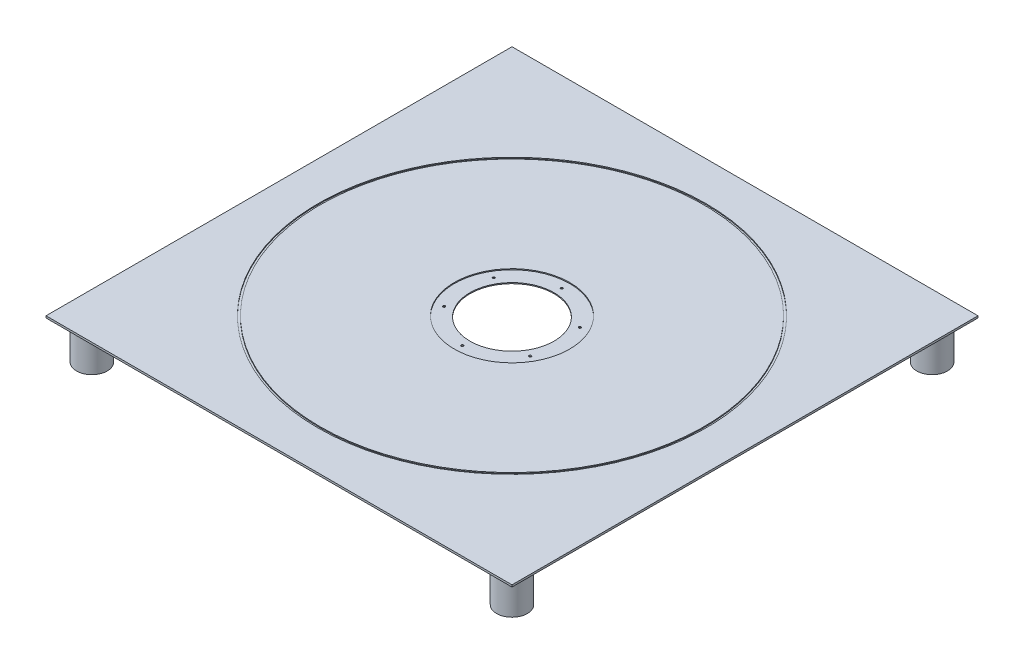
ISO-10303-21;
HEADER;
FILE_DESCRIPTION(('STEP AP214'),'2;1');
FILE_NAME('part.step','',(''),(''),'','','');
FILE_SCHEMA(('AUTOMOTIVE_DESIGN { 1 0 10303 214 1 1 1 1 }'));
ENDSEC;
DATA;
#1=APPLICATION_CONTEXT('core data for automotive mechanical design processes');
#2=APPLICATION_PROTOCOL_DEFINITION('international standard','automotive_design',2000,#1);
#3=PRODUCT_CONTEXT('',#1,'mechanical');
#4=PRODUCT('Part','Part','',(#3));
#5=PRODUCT_RELATED_PRODUCT_CATEGORY('part','',(#4));
#6=PRODUCT_DEFINITION_FORMATION('','',#4);
#7=PRODUCT_DEFINITION_CONTEXT('part definition',#1,'design');
#8=PRODUCT_DEFINITION('design','',#6,#7);
#9=PRODUCT_DEFINITION_SHAPE('','',#8);
#10=(LENGTH_UNIT() NAMED_UNIT(*) SI_UNIT(.MILLI.,.METRE.));
#11=(NAMED_UNIT(*) PLANE_ANGLE_UNIT() SI_UNIT($,.RADIAN.));
#12=(NAMED_UNIT(*) SI_UNIT($,.STERADIAN.) SOLID_ANGLE_UNIT());
#13=UNCERTAINTY_MEASURE_WITH_UNIT(LENGTH_MEASURE(1.E-05),#10,'distance_accuracy_value','');
#14=(GEOMETRIC_REPRESENTATION_CONTEXT(3) GLOBAL_UNCERTAINTY_ASSIGNED_CONTEXT((#13)) GLOBAL_UNIT_ASSIGNED_CONTEXT((#10,
#11,#12)) REPRESENTATION_CONTEXT('',''));
#15=CARTESIAN_POINT('',(0.,0.,0.));
#16=DIRECTION('',(0.,0.,1.));
#17=DIRECTION('',(1.,0.,0.));
#18=AXIS2_PLACEMENT_3D('',#15,#16,#17);
#19=CARTESIAN_POINT('',(0.,2.54,0.));
#20=DIRECTION('',(0.,-1.,0.));
#21=DIRECTION('',(0.,0.,-1.));
#22=AXIS2_PLACEMENT_3D('',#19,#20,#21);
#23=PLANE('',#22);
#24=CARTESIAN_POINT('',(0.,2.54,0.));
#25=DIRECTION('',(0.,-1.,0.));
#26=DIRECTION('',(0.,0.,-1.));
#27=AXIS2_PLACEMENT_3D('',#24,#25,#26);
#28=CIRCLE('',#27,75.5);
#29=CARTESIAN_POINT('',(0.,2.54,-75.5));
#30=VERTEX_POINT('',#29);
#31=EDGE_CURVE('E130',#30,#30,#28,.F.);
#32=ORIENTED_EDGE('',*,*,#31,.F.);
#33=EDGE_LOOP('',(#32));
#34=FACE_BOUND('',#33,.T.);
#35=CARTESIAN_POINT('',(0.,2.54,0.));
#36=DIRECTION('',(0.,1.,0.));
#37=DIRECTION('',(0.,0.,1.));
#38=AXIS2_PLACEMENT_3D('',#35,#36,#37);
#39=CIRCLE('',#38,251.206);
#40=CARTESIAN_POINT('',(0.,2.54,251.206));
#41=VERTEX_POINT('',#40);
#42=EDGE_CURVE('E299',#41,#41,#39,.T.);
#43=ORIENTED_EDGE('',*,*,#42,.T.);
#44=EDGE_LOOP('',(#43));
#45=FACE_BOUND('',#44,.T.);
#46=ADVANCED_FACE('F53',(#34,#45),#23,.F.);
#47=CARTESIAN_POINT('',(304.8,2.54,304.8));
#48=DIRECTION('',(-1.,0.,0.));
#49=DIRECTION('',(0.,0.,1.));
#50=AXIS2_PLACEMENT_3D('',#47,#48,#49);
#51=PLANE('',#50);
#52=DIRECTION('',(0.,0.,-1.));
#53=VECTOR('',#52,1.);
#54=CARTESIAN_POINT('',(304.8,0.,304.8));
#55=LINE('',#54,#53);
#56=CARTESIAN_POINT('',(304.8,0.,304.8));
#57=VERTEX_POINT('',#56);
#58=CARTESIAN_POINT('',(304.8,0.,-304.8));
#59=VERTEX_POINT('',#58);
#60=EDGE_CURVE('E126',#57,#59,#55,.T.);
#61=ORIENTED_EDGE('',*,*,#60,.T.);
#62=DIRECTION('',(0.,-1.,0.));
#63=VECTOR('',#62,1.);
#64=CARTESIAN_POINT('',(304.8,2.54,-304.8));
#65=LINE('',#64,#63);
#66=CARTESIAN_POINT('',(304.8,2.54,-304.8));
#67=VERTEX_POINT('',#66);
#68=EDGE_CURVE('E115',#67,#59,#65,.T.);
#69=ORIENTED_EDGE('',*,*,#68,.F.);
#70=DIRECTION('',(0.,0.,-1.));
#71=VECTOR('',#70,1.);
#72=CARTESIAN_POINT('',(304.8,2.54,304.8));
#73=LINE('',#72,#71);
#74=CARTESIAN_POINT('',(304.8,2.54,304.8));
#75=VERTEX_POINT('',#74);
#76=EDGE_CURVE('E107',#75,#67,#73,.T.);
#77=ORIENTED_EDGE('',*,*,#76,.F.);
#78=DIRECTION('',(0.,-1.,0.));
#79=VECTOR('',#78,1.);
#80=CARTESIAN_POINT('',(304.8,2.54,304.8));
#81=LINE('',#80,#79);
#82=EDGE_CURVE('E122',#75,#57,#81,.T.);
#83=ORIENTED_EDGE('',*,*,#82,.T.);
#84=EDGE_LOOP('',(#61,#69,#77,#83));
#85=FACE_BOUND('',#84,.T.);
#86=ADVANCED_FACE('F55',(#85),#51,.F.);
#87=CARTESIAN_POINT('',(-304.8,2.54,-304.8));
#88=DIRECTION('',(0.,0.,1.));
#89=DIRECTION('',(1.,0.,0.));
#90=AXIS2_PLACEMENT_3D('',#87,#88,#89);
#91=PLANE('',#90);
#92=DIRECTION('',(-1.,0.,0.));
#93=VECTOR('',#92,1.);
#94=CARTESIAN_POINT('',(-304.8,0.,-304.8));
#95=LINE('',#94,#93);
#96=CARTESIAN_POINT('',(-304.8,0.,-304.8));
#97=VERTEX_POINT('',#96);
#98=EDGE_CURVE('E113',#59,#97,#95,.T.);
#99=ORIENTED_EDGE('',*,*,#98,.T.);
#100=DIRECTION('',(0.,-1.,0.));
#101=VECTOR('',#100,1.);
#102=CARTESIAN_POINT('',(-304.8,2.54,-304.8));
#103=LINE('',#102,#101);
#104=CARTESIAN_POINT('',(-304.8,2.54,-304.8));
#105=VERTEX_POINT('',#104);
#106=EDGE_CURVE('E111',#105,#97,#103,.T.);
#107=ORIENTED_EDGE('',*,*,#106,.F.);
#108=DIRECTION('',(-1.,0.,0.));
#109=VECTOR('',#108,1.);
#110=CARTESIAN_POINT('',(-304.8,2.54,-304.8));
#111=LINE('',#110,#109);
#112=EDGE_CURVE('E102',#67,#105,#111,.T.);
#113=ORIENTED_EDGE('',*,*,#112,.F.);
#114=ORIENTED_EDGE('',*,*,#68,.T.);
#115=EDGE_LOOP('',(#99,#107,#113,#114));
#116=FACE_BOUND('',#115,.T.);
#117=ADVANCED_FACE('F112',(#116),#91,.F.);
#118=CARTESIAN_POINT('',(-304.8,2.54,304.8));
#119=DIRECTION('',(1.,0.,0.));
#120=DIRECTION('',(0.,0.,-1.));
#121=AXIS2_PLACEMENT_3D('',#118,#119,#120);
#122=PLANE('',#121);
#123=DIRECTION('',(0.,0.,1.));
#124=VECTOR('',#123,1.);
#125=CARTESIAN_POINT('',(-304.8,0.,304.8));
#126=LINE('',#125,#124);
#127=CARTESIAN_POINT('',(-304.8,0.,304.8));
#128=VERTEX_POINT('',#127);
#129=EDGE_CURVE('E88',#97,#128,#126,.T.);
#130=ORIENTED_EDGE('',*,*,#129,.T.);
#131=DIRECTION('',(0.,-1.,0.));
#132=VECTOR('',#131,1.);
#133=CARTESIAN_POINT('',(-304.8,2.54,304.8));
#134=LINE('',#133,#132);
#135=CARTESIAN_POINT('',(-304.8,2.54,304.8));
#136=VERTEX_POINT('',#135);
#137=EDGE_CURVE('E116',#136,#128,#134,.T.);
#138=ORIENTED_EDGE('',*,*,#137,.F.);
#139=DIRECTION('',(0.,0.,1.));
#140=VECTOR('',#139,1.);
#141=CARTESIAN_POINT('',(-304.8,2.54,304.8));
#142=LINE('',#141,#140);
#143=EDGE_CURVE('E105',#105,#136,#142,.T.);
#144=ORIENTED_EDGE('',*,*,#143,.F.);
#145=ORIENTED_EDGE('',*,*,#106,.T.);
#146=EDGE_LOOP('',(#130,#138,#144,#145));
#147=FACE_BOUND('',#146,.T.);
#148=ADVANCED_FACE('F118',(#147),#122,.F.);
#149=CARTESIAN_POINT('',(-304.8,2.54,304.8));
#150=DIRECTION('',(0.,0.,-1.));
#151=DIRECTION('',(-1.,0.,0.));
#152=AXIS2_PLACEMENT_3D('',#149,#150,#151);
#153=PLANE('',#152);
#154=DIRECTION('',(1.,0.,0.));
#155=VECTOR('',#154,1.);
#156=CARTESIAN_POINT('',(-304.8,0.,304.8));
#157=LINE('',#156,#155);
#158=EDGE_CURVE('E94',#128,#57,#157,.T.);
#159=ORIENTED_EDGE('',*,*,#158,.T.);
#160=ORIENTED_EDGE('',*,*,#82,.F.);
#161=DIRECTION('',(1.,0.,0.));
#162=VECTOR('',#161,1.);
#163=CARTESIAN_POINT('',(-304.8,2.54,304.8));
#164=LINE('',#163,#162);
#165=EDGE_CURVE('E71',#136,#75,#164,.T.);
#166=ORIENTED_EDGE('',*,*,#165,.F.);
#167=ORIENTED_EDGE('',*,*,#137,.T.);
#168=EDGE_LOOP('',(#159,#160,#166,#167));
#169=FACE_BOUND('',#168,.T.);
#170=ADVANCED_FACE('F196',(#169),#153,.F.);
#171=CARTESIAN_POINT('',(0.,2.54,0.));
#172=DIRECTION('',(0.,1.,0.));
#173=DIRECTION('',(0.,0.,1.));
#174=AXIS2_PLACEMENT_3D('',#171,#172,#173);
#175=CIRCLE('',#174,254.);
#176=CARTESIAN_POINT('',(0.,2.54,254.));
#177=VERTEX_POINT('',#176);
#178=EDGE_CURVE('E303',#177,#177,#175,.T.);
#179=ORIENTED_EDGE('',*,*,#178,.F.);
#180=EDGE_LOOP('',(#179));
#181=FACE_BOUND('',#180,.T.);
#182=ORIENTED_EDGE('',*,*,#76,.T.);
#183=ORIENTED_EDGE('',*,*,#112,.T.);
#184=ORIENTED_EDGE('',*,*,#143,.T.);
#185=ORIENTED_EDGE('',*,*,#165,.T.);
#186=EDGE_LOOP('',(#182,#183,#184,#185));
#187=FACE_BOUND('',#186,.T.);
#188=ADVANCED_FACE('F103',(#181,#187),#23,.F.);
#189=CARTESIAN_POINT('',(0.,0.,0.));
#190=DIRECTION('',(0.,-1.,0.));
#191=DIRECTION('',(0.,0.,-1.));
#192=AXIS2_PLACEMENT_3D('',#189,#190,#191);
#193=PLANE('',#192);
#194=CARTESIAN_POINT('',(274.8,0.,-274.8));
#195=DIRECTION('',(0.,-1.,0.));
#196=DIRECTION('',(0.,0.,1.));
#197=AXIS2_PLACEMENT_3D('',#194,#195,#196);
#198=CIRCLE('',#197,20.1233206745885);
#199=CARTESIAN_POINT('',(274.8,0.,-254.676679325411));
#200=VERTEX_POINT('',#199);
#201=EDGE_CURVE('E310',#200,#200,#198,.T.);
#202=ORIENTED_EDGE('',*,*,#201,.F.);
#203=EDGE_LOOP('',(#202));
#204=FACE_BOUND('',#203,.T.);
#205=CARTESIAN_POINT('',(-274.8,0.,-274.8));
#206=DIRECTION('',(0.,-1.,0.));
#207=DIRECTION('',(0.,0.,-1.));
#208=AXIS2_PLACEMENT_3D('',#205,#206,#207);
#209=CIRCLE('',#208,20.1233206745885);
#210=CARTESIAN_POINT('',(-274.8,0.,-294.923320674589));
#211=VERTEX_POINT('',#210);
#212=EDGE_CURVE('E12',#211,#211,#209,.T.);
#213=ORIENTED_EDGE('',*,*,#212,.F.);
#214=EDGE_LOOP('',(#213));
#215=FACE_BOUND('',#214,.T.);
#216=CARTESIAN_POINT('',(274.8,0.,274.8));
#217=DIRECTION('',(0.,-1.,0.));
#218=DIRECTION('',(0.,0.,-1.));
#219=AXIS2_PLACEMENT_3D('',#216,#217,#218);
#220=CIRCLE('',#219,20.1233206745885);
#221=CARTESIAN_POINT('',(274.8,0.,254.676679325411));
#222=VERTEX_POINT('',#221);
#223=EDGE_CURVE('E63',#222,#222,#220,.T.);
#224=ORIENTED_EDGE('',*,*,#223,.F.);
#225=EDGE_LOOP('',(#224));
#226=FACE_BOUND('',#225,.T.);
#227=CARTESIAN_POINT('',(-56.2916512459881,0.,-32.5000000000007));
#228=DIRECTION('',(0.,-1.,0.));
#229=DIRECTION('',(0.,0.,-1.));
#230=AXIS2_PLACEMENT_3D('',#227,#228,#229);
#231=CIRCLE('',#230,1.5);
#232=CARTESIAN_POINT('',(-56.2916512459881,0.,-34.0000000000007));
#233=VERTEX_POINT('',#232);
#234=EDGE_CURVE('E166',#233,#233,#231,.T.);
#235=ORIENTED_EDGE('',*,*,#234,.F.);
#236=EDGE_LOOP('',(#235));
#237=FACE_BOUND('',#236,.T.);
#238=CARTESIAN_POINT('',(-56.2916512459888,0.,32.4999999999995));
#239=DIRECTION('',(0.,-1.,0.));
#240=DIRECTION('',(0.,0.,-1.));
#241=AXIS2_PLACEMENT_3D('',#238,#239,#240);
#242=CIRCLE('',#241,1.5);
#243=CARTESIAN_POINT('',(-56.2916512459888,0.,30.9999999999995));
#244=VERTEX_POINT('',#243);
#245=EDGE_CURVE('E170',#244,#244,#242,.T.);
#246=ORIENTED_EDGE('',*,*,#245,.F.);
#247=EDGE_LOOP('',(#246));
#248=FACE_BOUND('',#247,.T.);
#249=CARTESIAN_POINT('',(0.,0.,65.));
#250=DIRECTION('',(0.,-1.,0.));
#251=DIRECTION('',(0.,0.,-1.));
#252=AXIS2_PLACEMENT_3D('',#249,#250,#251);
#253=CIRCLE('',#252,1.5);
#254=CARTESIAN_POINT('',(0.,0.,63.5));
#255=VERTEX_POINT('',#254);
#256=EDGE_CURVE('E174',#255,#255,#253,.T.);
#257=ORIENTED_EDGE('',*,*,#256,.F.);
#258=EDGE_LOOP('',(#257));
#259=FACE_BOUND('',#258,.T.);
#260=CARTESIAN_POINT('',(56.2916512459884,0.,32.5000000000003));
#261=DIRECTION('',(0.,-1.,0.));
#262=DIRECTION('',(0.,0.,-1.));
#263=AXIS2_PLACEMENT_3D('',#260,#261,#262);
#264=CIRCLE('',#263,1.5);
#265=CARTESIAN_POINT('',(56.2916512459884,0.,31.0000000000003));
#266=VERTEX_POINT('',#265);
#267=EDGE_CURVE('E178',#266,#266,#264,.T.);
#268=ORIENTED_EDGE('',*,*,#267,.F.);
#269=EDGE_LOOP('',(#268));
#270=FACE_BOUND('',#269,.T.);
#271=CARTESIAN_POINT('',(56.2916512459886,0.,-32.4999999999999));
#272=DIRECTION('',(0.,-1.,0.));
#273=DIRECTION('',(0.,0.,-1.));
#274=AXIS2_PLACEMENT_3D('',#271,#272,#273);
#275=CIRCLE('',#274,1.5);
#276=CARTESIAN_POINT('',(56.2916512459886,0.,-33.9999999999999));
#277=VERTEX_POINT('',#276);
#278=EDGE_CURVE('E182',#277,#277,#275,.T.);
#279=ORIENTED_EDGE('',*,*,#278,.F.);
#280=EDGE_LOOP('',(#279));
#281=FACE_BOUND('',#280,.T.);
#282=CARTESIAN_POINT('',(0.,0.,-65.));
#283=DIRECTION('',(0.,-1.,0.));
#284=DIRECTION('',(0.,0.,-1.));
#285=AXIS2_PLACEMENT_3D('',#282,#283,#284);
#286=CIRCLE('',#285,1.5);
#287=CARTESIAN_POINT('',(0.,0.,-66.5));
#288=VERTEX_POINT('',#287);
#289=EDGE_CURVE('E186',#288,#288,#286,.T.);
#290=ORIENTED_EDGE('',*,*,#289,.F.);
#291=EDGE_LOOP('',(#290));
#292=FACE_BOUND('',#291,.T.);
#293=CARTESIAN_POINT('',(-274.8,0.,274.8));
#294=DIRECTION('',(0.,-1.,0.));
#295=DIRECTION('',(0.,0.,-1.));
#296=AXIS2_PLACEMENT_3D('',#293,#294,#295);
#297=CIRCLE('',#296,20.1233206745885);
#298=CARTESIAN_POINT('',(-274.8,0.,254.676679325411));
#299=VERTEX_POINT('',#298);
#300=EDGE_CURVE('E190',#299,#299,#297,.T.);
#301=ORIENTED_EDGE('',*,*,#300,.F.);
#302=EDGE_LOOP('',(#301));
#303=FACE_BOUND('',#302,.T.);
#304=CARTESIAN_POINT('',(0.,0.,0.));
#305=DIRECTION('',(0.,1.,0.));
#306=DIRECTION('',(0.,0.,1.));
#307=AXIS2_PLACEMENT_3D('',#304,#305,#306);
#308=CIRCLE('',#307,55.);
#309=CARTESIAN_POINT('',(0.,0.,55.));
#310=VERTEX_POINT('',#309);
#311=EDGE_CURVE('E150',#310,#310,#308,.T.);
#312=ORIENTED_EDGE('',*,*,#311,.T.);
#313=EDGE_LOOP('',(#312));
#314=FACE_BOUND('',#313,.T.);
#315=ORIENTED_EDGE('',*,*,#60,.F.);
#316=ORIENTED_EDGE('',*,*,#158,.F.);
#317=ORIENTED_EDGE('',*,*,#129,.F.);
#318=ORIENTED_EDGE('',*,*,#98,.F.);
#319=EDGE_LOOP('',(#315,#316,#317,#318));
#320=FACE_BOUND('',#319,.T.);
#321=ADVANCED_FACE('F157',(#204,#215,#226,#237,#248,#259,#270,#281,#292,#303,#314,#320),#193,.T.);
#322=CARTESIAN_POINT('',(0.,2.540012,0.));
#323=DIRECTION('',(0.,-1.,0.));
#324=DIRECTION('',(0.,0.,-1.));
#325=AXIS2_PLACEMENT_3D('',#322,#323,#324);
#326=CYLINDRICAL_SURFACE('',#325,75.5);
#327=CARTESIAN_POINT('',(0.,1.27,0.));
#328=DIRECTION('',(0.,1.,0.));
#329=DIRECTION('',(0.,0.,1.));
#330=AXIS2_PLACEMENT_3D('',#327,#328,#329);
#331=CIRCLE('',#330,75.5);
#332=CARTESIAN_POINT('',(0.,1.27,-75.5));
#333=VERTEX_POINT('',#332);
#334=EDGE_CURVE('E146',#333,#333,#331,.T.);
#335=CARTESIAN_POINT('',(0.,1.27,-75.5));
#336=CARTESIAN_POINT('',(0.,1.28322916666667,-75.5));
#337=CARTESIAN_POINT('',(0.,1.29645833333333,-75.5));
#338=CARTESIAN_POINT('',(0.,1.32291666666667,-75.5));
#339=CARTESIAN_POINT('',(0.,1.33614583333333,-75.5));
#340=CARTESIAN_POINT('',(0.,1.36260416666667,-75.5));
#341=CARTESIAN_POINT('',(0.,1.37583333333333,-75.5));
#342=CARTESIAN_POINT('',(0.,1.40229166666667,-75.5));
#343=CARTESIAN_POINT('',(0.,1.41552083333333,-75.5));
#344=CARTESIAN_POINT('',(0.,1.44197916666667,-75.5));
#345=CARTESIAN_POINT('',(0.,1.45520833333333,-75.5));
#346=CARTESIAN_POINT('',(0.,1.48166666666667,-75.5));
#347=CARTESIAN_POINT('',(0.,1.49489583333333,-75.5));
#348=CARTESIAN_POINT('',(0.,1.52135416666667,-75.5));
#349=CARTESIAN_POINT('',(0.,1.53458333333333,-75.5));
#350=CARTESIAN_POINT('',(0.,1.56104166666667,-75.5));
#351=CARTESIAN_POINT('',(0.,1.57427083333333,-75.5));
#352=CARTESIAN_POINT('',(0.,1.60072916666667,-75.5));
#353=CARTESIAN_POINT('',(0.,1.61395833333333,-75.5));
#354=CARTESIAN_POINT('',(0.,1.64041666666667,-75.5));
#355=CARTESIAN_POINT('',(0.,1.65364583333333,-75.5));
#356=CARTESIAN_POINT('',(0.,1.68010416666667,-75.5));
#357=CARTESIAN_POINT('',(0.,1.69333333333333,-75.5));
#358=CARTESIAN_POINT('',(0.,1.71979166666667,-75.5));
#359=CARTESIAN_POINT('',(0.,1.73302083333333,-75.5));
#360=CARTESIAN_POINT('',(0.,1.75947916666667,-75.5));
#361=CARTESIAN_POINT('',(0.,1.77270833333333,-75.5));
#362=CARTESIAN_POINT('',(0.,1.79916666666667,-75.5));
#363=CARTESIAN_POINT('',(0.,1.81239583333333,-75.5));
#364=CARTESIAN_POINT('',(0.,1.83885416666667,-75.5));
#365=CARTESIAN_POINT('',(0.,1.85208333333333,-75.5));
#366=CARTESIAN_POINT('',(0.,1.87854166666667,-75.5));
#367=CARTESIAN_POINT('',(0.,1.89177083333333,-75.5));
#368=CARTESIAN_POINT('',(0.,1.91822916666667,-75.5));
#369=CARTESIAN_POINT('',(0.,1.93145833333333,-75.5));
#370=CARTESIAN_POINT('',(0.,1.95791666666667,-75.5));
#371=CARTESIAN_POINT('',(0.,1.97114583333333,-75.5));
#372=CARTESIAN_POINT('',(0.,1.99760416666667,-75.5));
#373=CARTESIAN_POINT('',(0.,2.01083333333333,-75.5));
#374=CARTESIAN_POINT('',(0.,2.03729166666667,-75.5));
#375=CARTESIAN_POINT('',(0.,2.05052083333333,-75.5));
#376=CARTESIAN_POINT('',(0.,2.07697916666667,-75.5));
#377=CARTESIAN_POINT('',(0.,2.09020833333333,-75.5));
#378=CARTESIAN_POINT('',(0.,2.11666666666667,-75.5));
#379=CARTESIAN_POINT('',(0.,2.12989583333333,-75.5));
#380=CARTESIAN_POINT('',(0.,2.15635416666667,-75.5));
#381=CARTESIAN_POINT('',(0.,2.16958333333333,-75.5));
#382=CARTESIAN_POINT('',(0.,2.19604166666667,-75.5));
#383=CARTESIAN_POINT('',(0.,2.20927083333333,-75.5));
#384=CARTESIAN_POINT('',(0.,2.23572916666667,-75.5));
#385=CARTESIAN_POINT('',(0.,2.24895833333333,-75.5));
#386=CARTESIAN_POINT('',(0.,2.27541666666667,-75.5));
#387=CARTESIAN_POINT('',(0.,2.28864583333333,-75.5));
#388=CARTESIAN_POINT('',(0.,2.31510416666667,-75.5));
#389=CARTESIAN_POINT('',(0.,2.32833333333333,-75.5));
#390=CARTESIAN_POINT('',(0.,2.35479166666667,-75.5));
#391=CARTESIAN_POINT('',(0.,2.36802083333333,-75.5));
#392=CARTESIAN_POINT('',(0.,2.39447916666667,-75.5));
#393=CARTESIAN_POINT('',(0.,2.40770833333333,-75.5));
#394=CARTESIAN_POINT('',(0.,2.43416666666667,-75.5));
#395=CARTESIAN_POINT('',(0.,2.44739583333333,-75.5));
#396=CARTESIAN_POINT('',(0.,2.47385416666667,-75.5));
#397=CARTESIAN_POINT('',(0.,2.48708333333333,-75.5));
#398=CARTESIAN_POINT('',(0.,2.51354166666667,-75.5));
#399=CARTESIAN_POINT('',(0.,2.52677083333333,-75.5));
#400=CARTESIAN_POINT('',(0.,2.54,-75.5));
#401=B_SPLINE_CURVE_WITH_KNOTS('',3,(#335,#336,#337,#338,#339,#340,#341,#342,#343,#344,#345,
#346,#347,#348,#349,#350,#351,#352,#353,#354,#355,#356,#357,#358,#359,#360,#361,#362,#363,#364,
#365,#366,#367,#368,#369,#370,#371,#372,#373,#374,#375,#376,#377,#378,#379,#380,#381,#382,#383,
#384,#385,#386,#387,#388,#389,#390,#391,#392,#393,#394,#395,#396,#397,#398,#399,#400),
.UNSPECIFIED.,.F.,.F.,(4,2,2,2,2,2,2,2,2,2,2,2,2,2,2,2,2,2,2,2,2,2,2,2,2,2,2,2,2,2,2,2,4),(0.,
0.0396875,0.079375,0.1190625,0.15875,0.1984375,0.238125,0.2778125,0.3175,0.3571875,0.396875,
0.4365625,0.47625,0.5159375,0.555625,0.5953125,0.635,0.6746875,0.714375,0.7540625,0.79375,
0.8334375,0.873125,0.9128125,0.9525,0.9921875,1.031875,1.0715625,1.11125,1.1509375,1.190625,
1.2303125,1.27),.UNSPECIFIED.);
#402=EDGE_CURVE('BSEAM160',#333,#30,#401,.T.);
#403=ORIENTED_EDGE('',*,*,#334,.F.);
#404=ORIENTED_EDGE('',*,*,#31,.T.);
#405=ORIENTED_EDGE('',*,*,#402,.T.);
#406=ORIENTED_EDGE('',*,*,#402,.F.);
#407=EDGE_LOOP('',(#403,#405,#404,#406));
#408=FACE_BOUND('',#407,.T.);
#409=ADVANCED_FACE('F160',(#408),#326,.F.);
#410=CARTESIAN_POINT('',(0.,1.27,0.));
#411=DIRECTION('',(0.,1.,0.));
#412=DIRECTION('',(0.,0.,1.));
#413=AXIS2_PLACEMENT_3D('',#410,#411,#412);
#414=PLANE('',#413);
#415=CARTESIAN_POINT('',(-56.2916512459881,1.27,-32.5000000000007));
#416=DIRECTION('',(0.,1.,0.));
#417=DIRECTION('',(0.866025403784433,0.,0.50000000000001));
#418=AXIS2_PLACEMENT_3D('',#415,#416,#417);
#419=CIRCLE('',#418,1.5);
#420=CARTESIAN_POINT('',(-54.9926131403115,1.27,-31.7500000000006));
#421=VERTEX_POINT('',#420);
#422=EDGE_CURVE('E329',#421,#421,#419,.T.);
#423=ORIENTED_EDGE('',*,*,#422,.F.);
#424=EDGE_LOOP('',(#423));
#425=FACE_BOUND('',#424,.T.);
#426=CARTESIAN_POINT('',(-56.2916512459888,1.27,32.4999999999995));
#427=DIRECTION('',(0.,1.,0.));
#428=DIRECTION('',(0.866025403784443,0.,-0.499999999999992));
#429=AXIS2_PLACEMENT_3D('',#426,#427,#428);
#430=CIRCLE('',#429,1.5);
#431=CARTESIAN_POINT('',(-54.9926131403121,1.27,31.7499999999995));
#432=VERTEX_POINT('',#431);
#433=EDGE_CURVE('E339',#432,#432,#430,.T.);
#434=ORIENTED_EDGE('',*,*,#433,.F.);
#435=EDGE_LOOP('',(#434));
#436=FACE_BOUND('',#435,.T.);
#437=CARTESIAN_POINT('',(0.,1.27,65.));
#438=DIRECTION('',(0.,1.,0.));
#439=DIRECTION('',(0.,0.,-1.));
#440=AXIS2_PLACEMENT_3D('',#437,#438,#439);
#441=CIRCLE('',#440,1.5);
#442=CARTESIAN_POINT('',(0.,1.27,63.5));
#443=VERTEX_POINT('',#442);
#444=EDGE_CURVE('E335',#443,#443,#441,.T.);
#445=ORIENTED_EDGE('',*,*,#444,.F.);
#446=EDGE_LOOP('',(#445));
#447=FACE_BOUND('',#446,.T.);
#448=CARTESIAN_POINT('',(56.2916512459884,1.27,32.5000000000003));
#449=DIRECTION('',(0.,1.,0.));
#450=DIRECTION('',(-0.866025403784436,0.,-0.500000000000004));
#451=AXIS2_PLACEMENT_3D('',#448,#449,#450);
#452=CIRCLE('',#451,1.5);
#453=CARTESIAN_POINT('',(54.9926131403117,1.27,31.7500000000003));
#454=VERTEX_POINT('',#453);
#455=EDGE_CURVE('E330',#454,#454,#452,.T.);
#456=ORIENTED_EDGE('',*,*,#455,.F.);
#457=EDGE_LOOP('',(#456));
#458=FACE_BOUND('',#457,.T.);
#459=CARTESIAN_POINT('',(56.2916512459886,1.27,-32.4999999999999));
#460=DIRECTION('',(0.,1.,0.));
#461=DIRECTION('',(-0.86602540378444,0.,0.499999999999998));
#462=AXIS2_PLACEMENT_3D('',#459,#460,#461);
#463=CIRCLE('',#462,1.5);
#464=CARTESIAN_POINT('',(54.9926131403119,1.27,-31.7499999999999));
#465=VERTEX_POINT('',#464);
#466=EDGE_CURVE('E334',#465,#465,#463,.T.);
#467=ORIENTED_EDGE('',*,*,#466,.F.);
#468=EDGE_LOOP('',(#467));
#469=FACE_BOUND('',#468,.T.);
#470=CARTESIAN_POINT('',(0.,1.27,-65.));
#471=DIRECTION('',(0.,1.,0.));
#472=DIRECTION('',(0.,0.,1.));
#473=AXIS2_PLACEMENT_3D('',#470,#471,#472);
#474=CIRCLE('',#473,1.5);
#475=CARTESIAN_POINT('',(0.,1.27,-63.5));
#476=VERTEX_POINT('',#475);
#477=EDGE_CURVE('E359',#476,#476,#474,.T.);
#478=ORIENTED_EDGE('',*,*,#477,.F.);
#479=EDGE_LOOP('',(#478));
#480=FACE_BOUND('',#479,.T.);
#481=CARTESIAN_POINT('',(0.,1.27,0.));
#482=DIRECTION('',(0.,1.,0.));
#483=DIRECTION('',(0.,0.,1.));
#484=AXIS2_PLACEMENT_3D('',#481,#482,#483);
#485=CIRCLE('',#484,55.);
#486=CARTESIAN_POINT('',(0.,1.27,55.));
#487=VERTEX_POINT('',#486);
#488=EDGE_CURVE('E147',#487,#487,#485,.T.);
#489=ORIENTED_EDGE('',*,*,#488,.F.);
#490=EDGE_LOOP('',(#489));
#491=FACE_BOUND('',#490,.T.);
#492=ORIENTED_EDGE('',*,*,#334,.T.);
#493=EDGE_LOOP('',(#492));
#494=FACE_BOUND('',#493,.T.);
#495=ADVANCED_FACE('F217',(#425,#436,#447,#458,#469,#480,#491,#494),#414,.T.);
#496=CARTESIAN_POINT('',(0.,0.,0.));
#497=DIRECTION('',(0.,1.,0.));
#498=DIRECTION('',(0.,0.,1.));
#499=AXIS2_PLACEMENT_3D('',#496,#497,#498);
#500=CYLINDRICAL_SURFACE('',#499,55.);
#501=ORIENTED_EDGE('',*,*,#488,.T.);
#502=EDGE_LOOP('',(#501));
#503=FACE_BOUND('',#502,.T.);
#504=ORIENTED_EDGE('',*,*,#311,.F.);
#505=EDGE_LOOP('',(#504));
#506=FACE_BOUND('',#505,.T.);
#507=ADVANCED_FACE('F221',(#503,#506),#500,.F.);
#508=CARTESIAN_POINT('',(-274.8,-50.,274.8));
#509=DIRECTION('',(0.,1.,0.));
#510=DIRECTION('',(0.,0.,1.));
#511=AXIS2_PLACEMENT_3D('',#508,#509,#510);
#512=CYLINDRICAL_SURFACE('',#511,20.1233206745885);
#513=CARTESIAN_POINT('',(-274.8,-50.,274.8));
#514=DIRECTION('',(0.,-1.,0.));
#515=DIRECTION('',(0.,0.,-1.));
#516=AXIS2_PLACEMENT_3D('',#513,#514,#515);
#517=CIRCLE('',#516,20.1233206745885);
#518=CARTESIAN_POINT('',(-274.8,-50.,254.676679325411));
#519=VERTEX_POINT('',#518);
#520=EDGE_CURVE('E365',#519,#519,#517,.T.);
#521=ORIENTED_EDGE('',*,*,#520,.F.);
#522=EDGE_LOOP('',(#521));
#523=FACE_BOUND('',#522,.T.);
#524=ORIENTED_EDGE('',*,*,#300,.T.);
#525=EDGE_LOOP('',(#524));
#526=FACE_BOUND('',#525,.T.);
#527=ADVANCED_FACE('F225',(#523,#526),#512,.T.);
#528=CARTESIAN_POINT('',(-274.8,-50.,274.8));
#529=DIRECTION('',(0.,-1.,0.));
#530=DIRECTION('',(0.,0.,-1.));
#531=AXIS2_PLACEMENT_3D('',#528,#529,#530);
#532=PLANE('',#531);
#533=ORIENTED_EDGE('',*,*,#520,.T.);
#534=EDGE_LOOP('',(#533));
#535=FACE_BOUND('',#534,.T.);
#536=ADVANCED_FACE('F229',(#535),#532,.T.);
#537=CARTESIAN_POINT('',(0.,-8.73,-65.));
#538=DIRECTION('',(0.,1.,0.));
#539=DIRECTION('',(0.,0.,1.));
#540=AXIS2_PLACEMENT_3D('',#537,#538,#539);
#541=CYLINDRICAL_SURFACE('',#540,1.5);
#542=ORIENTED_EDGE('',*,*,#289,.T.);
#543=EDGE_LOOP('',(#542));
#544=FACE_BOUND('',#543,.T.);
#545=ORIENTED_EDGE('',*,*,#477,.T.);
#546=EDGE_LOOP('',(#545));
#547=FACE_BOUND('',#546,.T.);
#548=ADVANCED_FACE('F233',(#544,#547),#541,.F.);
#549=CARTESIAN_POINT('',(56.2916512459886,-8.73,-32.4999999999999));
#550=DIRECTION('',(0.,1.,0.));
#551=DIRECTION('',(0.,0.,1.));
#552=AXIS2_PLACEMENT_3D('',#549,#550,#551);
#553=CYLINDRICAL_SURFACE('',#552,1.5);
#554=ORIENTED_EDGE('',*,*,#278,.T.);
#555=EDGE_LOOP('',(#554));
#556=FACE_BOUND('',#555,.T.);
#557=ORIENTED_EDGE('',*,*,#466,.T.);
#558=EDGE_LOOP('',(#557));
#559=FACE_BOUND('',#558,.T.);
#560=ADVANCED_FACE('F237',(#556,#559),#553,.F.);
#561=CARTESIAN_POINT('',(56.2916512459884,-8.73,32.5000000000003));
#562=DIRECTION('',(0.,1.,0.));
#563=DIRECTION('',(0.,0.,1.));
#564=AXIS2_PLACEMENT_3D('',#561,#562,#563);
#565=CYLINDRICAL_SURFACE('',#564,1.5);
#566=ORIENTED_EDGE('',*,*,#267,.T.);
#567=EDGE_LOOP('',(#566));
#568=FACE_BOUND('',#567,.T.);
#569=ORIENTED_EDGE('',*,*,#455,.T.);
#570=EDGE_LOOP('',(#569));
#571=FACE_BOUND('',#570,.T.);
#572=ADVANCED_FACE('F241',(#568,#571),#565,.F.);
#573=CARTESIAN_POINT('',(0.,-8.73,65.));
#574=DIRECTION('',(0.,1.,0.));
#575=DIRECTION('',(0.,0.,1.));
#576=AXIS2_PLACEMENT_3D('',#573,#574,#575);
#577=CYLINDRICAL_SURFACE('',#576,1.5);
#578=ORIENTED_EDGE('',*,*,#256,.T.);
#579=EDGE_LOOP('',(#578));
#580=FACE_BOUND('',#579,.T.);
#581=ORIENTED_EDGE('',*,*,#444,.T.);
#582=EDGE_LOOP('',(#581));
#583=FACE_BOUND('',#582,.T.);
#584=ADVANCED_FACE('F250',(#580,#583),#577,.F.);
#585=CARTESIAN_POINT('',(-56.2916512459888,-8.73,32.4999999999995));
#586=DIRECTION('',(0.,1.,0.));
#587=DIRECTION('',(0.,0.,1.));
#588=AXIS2_PLACEMENT_3D('',#585,#586,#587);
#589=CYLINDRICAL_SURFACE('',#588,1.5);
#590=ORIENTED_EDGE('',*,*,#245,.T.);
#591=EDGE_LOOP('',(#590));
#592=FACE_BOUND('',#591,.T.);
#593=ORIENTED_EDGE('',*,*,#433,.T.);
#594=EDGE_LOOP('',(#593));
#595=FACE_BOUND('',#594,.T.);
#596=ADVANCED_FACE('F246',(#592,#595),#589,.F.);
#597=CARTESIAN_POINT('',(-56.2916512459881,-8.73,-32.5000000000007));
#598=DIRECTION('',(0.,1.,0.));
#599=DIRECTION('',(0.,0.,1.));
#600=AXIS2_PLACEMENT_3D('',#597,#598,#599);
#601=CYLINDRICAL_SURFACE('',#600,1.5);
#602=ORIENTED_EDGE('',*,*,#234,.T.);
#603=EDGE_LOOP('',(#602));
#604=FACE_BOUND('',#603,.T.);
#605=ORIENTED_EDGE('',*,*,#422,.T.);
#606=EDGE_LOOP('',(#605));
#607=FACE_BOUND('',#606,.T.);
#608=ADVANCED_FACE('F243',(#604,#607),#601,.F.);
#609=CARTESIAN_POINT('',(274.8,-50.,274.8));
#610=DIRECTION('',(0.,1.,0.));
#611=DIRECTION('',(0.,0.,1.));
#612=AXIS2_PLACEMENT_3D('',#609,#610,#611);
#613=CYLINDRICAL_SURFACE('',#612,20.1233206745885);
#614=CARTESIAN_POINT('',(274.8,-50.,274.8));
#615=DIRECTION('',(0.,1.,0.));
#616=DIRECTION('',(0.,0.,-1.));
#617=AXIS2_PLACEMENT_3D('',#614,#615,#616);
#618=CIRCLE('',#617,20.1233206745885);
#619=CARTESIAN_POINT('',(274.8,-50.,254.676679325411));
#620=VERTEX_POINT('',#619);
#621=EDGE_CURVE('E325',#620,#620,#618,.T.);
#622=ORIENTED_EDGE('',*,*,#621,.T.);
#623=EDGE_LOOP('',(#622));
#624=FACE_BOUND('',#623,.T.);
#625=ORIENTED_EDGE('',*,*,#223,.T.);
#626=EDGE_LOOP('',(#625));
#627=FACE_BOUND('',#626,.T.);
#628=ADVANCED_FACE('F155',(#624,#627),#613,.T.);
#629=CARTESIAN_POINT('',(274.8,-50.,274.8));
#630=DIRECTION('',(0.,-1.,0.));
#631=DIRECTION('',(0.,0.,-1.));
#632=AXIS2_PLACEMENT_3D('',#629,#630,#631);
#633=PLANE('',#632);
#634=ORIENTED_EDGE('',*,*,#621,.F.);
#635=EDGE_LOOP('',(#634));
#636=FACE_BOUND('',#635,.T.);
#637=ADVANCED_FACE('F260',(#636),#633,.T.);
#638=CARTESIAN_POINT('',(-274.8,-50.,-274.8));
#639=DIRECTION('',(0.,1.,0.));
#640=DIRECTION('',(0.,0.,1.));
#641=AXIS2_PLACEMENT_3D('',#638,#639,#640);
#642=CYLINDRICAL_SURFACE('',#641,20.1233206745885);
#643=CARTESIAN_POINT('',(-274.8,-50.,-274.8));
#644=DIRECTION('',(0.,1.,0.));
#645=DIRECTION('',(0.,0.,1.));
#646=AXIS2_PLACEMENT_3D('',#643,#644,#645);
#647=CIRCLE('',#646,20.1233206745885);
#648=CARTESIAN_POINT('',(-274.8,-50.,-254.676679325411));
#649=VERTEX_POINT('',#648);
#650=EDGE_CURVE('E318',#649,#649,#647,.T.);
#651=ORIENTED_EDGE('',*,*,#650,.T.);
#652=EDGE_LOOP('',(#651));
#653=FACE_BOUND('',#652,.T.);
#654=ORIENTED_EDGE('',*,*,#212,.T.);
#655=EDGE_LOOP('',(#654));
#656=FACE_BOUND('',#655,.T.);
#657=ADVANCED_FACE('F264',(#653,#656),#642,.T.);
#658=CARTESIAN_POINT('',(-274.8,-50.,-274.8));
#659=DIRECTION('',(0.,-1.,0.));
#660=DIRECTION('',(0.,0.,1.));
#661=AXIS2_PLACEMENT_3D('',#658,#659,#660);
#662=PLANE('',#661);
#663=ORIENTED_EDGE('',*,*,#650,.F.);
#664=EDGE_LOOP('',(#663));
#665=FACE_BOUND('',#664,.T.);
#666=ADVANCED_FACE('F268',(#665),#662,.T.);
#667=CARTESIAN_POINT('',(274.8,-50.,-274.8));
#668=DIRECTION('',(0.,1.,0.));
#669=DIRECTION('',(0.,0.,1.));
#670=AXIS2_PLACEMENT_3D('',#667,#668,#669);
#671=CYLINDRICAL_SURFACE('',#670,20.1233206745885);
#672=CARTESIAN_POINT('',(274.8,-50.,-274.8));
#673=DIRECTION('',(0.,-1.,0.));
#674=DIRECTION('',(0.,0.,1.));
#675=AXIS2_PLACEMENT_3D('',#672,#673,#674);
#676=CIRCLE('',#675,20.1233206745885);
#677=CARTESIAN_POINT('',(274.8,-50.,-254.676679325411));
#678=VERTEX_POINT('',#677);
#679=EDGE_CURVE('E314',#678,#678,#676,.T.);
#680=ORIENTED_EDGE('',*,*,#679,.F.);
#681=EDGE_LOOP('',(#680));
#682=FACE_BOUND('',#681,.T.);
#683=ORIENTED_EDGE('',*,*,#201,.T.);
#684=EDGE_LOOP('',(#683));
#685=FACE_BOUND('',#684,.T.);
#686=ADVANCED_FACE('F272',(#682,#685),#671,.T.);
#687=CARTESIAN_POINT('',(274.8,-50.,-274.8));
#688=DIRECTION('',(0.,-1.,0.));
#689=DIRECTION('',(0.,0.,1.));
#690=AXIS2_PLACEMENT_3D('',#687,#688,#689);
#691=PLANE('',#690);
#692=ORIENTED_EDGE('',*,*,#679,.T.);
#693=EDGE_LOOP('',(#692));
#694=FACE_BOUND('',#693,.T.);
#695=ADVANCED_FACE('F276',(#694),#691,.T.);
#696=CARTESIAN_POINT('',(0.,1.27,0.));
#697=DIRECTION('',(0.,1.,0.));
#698=DIRECTION('',(0.,0.,1.));
#699=AXIS2_PLACEMENT_3D('',#696,#697,#698);
#700=CYLINDRICAL_SURFACE('',#699,254.);
#701=CARTESIAN_POINT('',(0.,1.27,0.));
#702=DIRECTION('',(0.,1.,0.));
#703=DIRECTION('',(0.,0.,1.));
#704=AXIS2_PLACEMENT_3D('',#701,#702,#703);
#705=CIRCLE('',#704,254.);
#706=CARTESIAN_POINT('',(0.,1.27,254.));
#707=VERTEX_POINT('',#706);
#708=EDGE_CURVE('E306',#707,#707,#705,.T.);
#709=ORIENTED_EDGE('',*,*,#708,.F.);
#710=EDGE_LOOP('',(#709));
#711=FACE_BOUND('',#710,.T.);
#712=ORIENTED_EDGE('',*,*,#178,.T.);
#713=EDGE_LOOP('',(#712));
#714=FACE_BOUND('',#713,.T.);
#715=ADVANCED_FACE('F279',(#711,#714),#700,.F.);
#716=CARTESIAN_POINT('',(0.,1.27,0.));
#717=DIRECTION('',(0.,1.,0.));
#718=DIRECTION('',(0.,0.,1.));
#719=AXIS2_PLACEMENT_3D('',#716,#717,#718);
#720=PLANE('',#719);
#721=CARTESIAN_POINT('',(0.,1.27,0.));
#722=DIRECTION('',(0.,1.,0.));
#723=DIRECTION('',(0.,0.,1.));
#724=AXIS2_PLACEMENT_3D('',#721,#722,#723);
#725=CIRCLE('',#724,251.206);
#726=CARTESIAN_POINT('',(0.,1.27,251.206));
#727=VERTEX_POINT('',#726);
#728=EDGE_CURVE('E296',#727,#727,#725,.T.);
#729=ORIENTED_EDGE('',*,*,#728,.F.);
#730=EDGE_LOOP('',(#729));
#731=FACE_BOUND('',#730,.T.);
#732=ORIENTED_EDGE('',*,*,#708,.T.);
#733=EDGE_LOOP('',(#732));
#734=FACE_BOUND('',#733,.T.);
#735=ADVANCED_FACE('F283',(#731,#734),#720,.T.);
#736=CARTESIAN_POINT('',(0.,1.27,0.));
#737=DIRECTION('',(0.,1.,0.));
#738=DIRECTION('',(0.,0.,1.));
#739=AXIS2_PLACEMENT_3D('',#736,#737,#738);
#740=CYLINDRICAL_SURFACE('',#739,251.206);
#741=ORIENTED_EDGE('',*,*,#728,.T.);
#742=EDGE_LOOP('',(#741));
#743=FACE_BOUND('',#742,.T.);
#744=ORIENTED_EDGE('',*,*,#42,.F.);
#745=EDGE_LOOP('',(#744));
#746=FACE_BOUND('',#745,.T.);
#747=ADVANCED_FACE('F287',(#743,#746),#740,.T.);
#748=CLOSED_SHELL('',(#46,#86,#117,#148,#170,#188,#321,#409,#495,#507,#527,#536,#548,#560,#572,
#584,#596,#608,#628,#637,#657,#666,#686,#695,#715,#735,#747));
#749=MANIFOLD_SOLID_BREP('B2',#748);
#750=ADVANCED_BREP_SHAPE_REPRESENTATION('',(#18,#749),#14);
#751=SHAPE_DEFINITION_REPRESENTATION(#9,#750);
ENDSEC;
END-ISO-10303-21;
